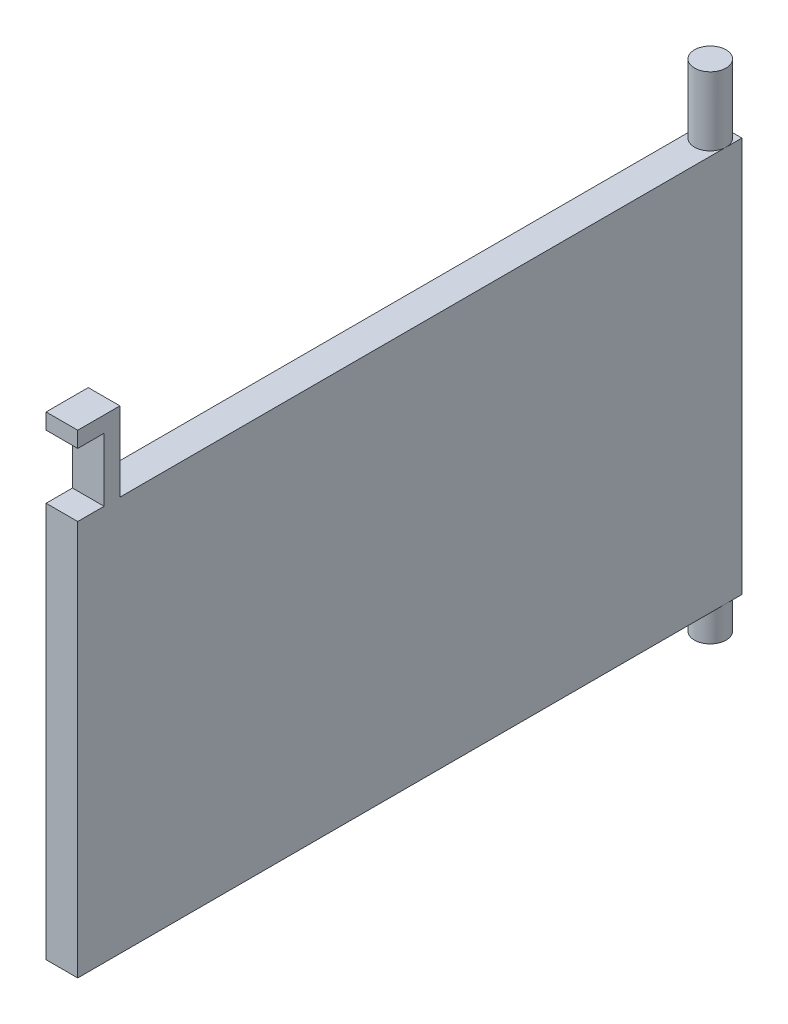
ISO-10303-21;
HEADER;
FILE_DESCRIPTION(('STEP AP214'),'2;1');
FILE_NAME('part.step','',(''),(''),'','','');
FILE_SCHEMA(('AUTOMOTIVE_DESIGN { 1 0 10303 214 1 1 1 1 }'));
ENDSEC;
DATA;
#1=APPLICATION_CONTEXT('core data for automotive mechanical design processes');
#2=APPLICATION_PROTOCOL_DEFINITION('international standard','automotive_design',2000,#1);
#3=PRODUCT_CONTEXT('',#1,'mechanical');
#4=PRODUCT('Part','Part','',(#3));
#5=PRODUCT_RELATED_PRODUCT_CATEGORY('part','',(#4));
#6=PRODUCT_DEFINITION_FORMATION('','',#4);
#7=PRODUCT_DEFINITION_CONTEXT('part definition',#1,'design');
#8=PRODUCT_DEFINITION('design','',#6,#7);
#9=PRODUCT_DEFINITION_SHAPE('','',#8);
#10=(LENGTH_UNIT() NAMED_UNIT(*) SI_UNIT(.MILLI.,.METRE.));
#11=(NAMED_UNIT(*) PLANE_ANGLE_UNIT() SI_UNIT($,.RADIAN.));
#12=(NAMED_UNIT(*) SI_UNIT($,.STERADIAN.) SOLID_ANGLE_UNIT());
#13=UNCERTAINTY_MEASURE_WITH_UNIT(LENGTH_MEASURE(1.E-05),#10,'distance_accuracy_value','');
#14=(GEOMETRIC_REPRESENTATION_CONTEXT(3) GLOBAL_UNCERTAINTY_ASSIGNED_CONTEXT((#13)) GLOBAL_UNIT_ASSIGNED_CONTEXT((#10,
#11,#12)) REPRESENTATION_CONTEXT('',''));
#15=CARTESIAN_POINT('',(0.,0.,0.));
#16=DIRECTION('',(0.,0.,1.));
#17=DIRECTION('',(1.,0.,0.));
#18=AXIS2_PLACEMENT_3D('',#15,#16,#17);
#19=CARTESIAN_POINT('',(0.,100.,121.));
#20=DIRECTION('',(0.,0.,-1.));
#21=DIRECTION('',(-1.,0.,0.));
#22=AXIS2_PLACEMENT_3D('',#19,#20,#21);
#23=PLANE('',#22);
#24=DIRECTION('',(1.,0.,0.));
#25=VECTOR('',#24,1.);
#26=CARTESIAN_POINT('',(0.,97.,121.));
#27=LINE('',#26,#25);
#28=CARTESIAN_POINT('',(0.,97.,121.));
#29=VERTEX_POINT('',#28);
#30=CARTESIAN_POINT('',(6.,97.,121.));
#31=VERTEX_POINT('',#30);
#32=EDGE_CURVE('E167',#29,#31,#27,.T.);
#33=ORIENTED_EDGE('',*,*,#32,.F.);
#34=DIRECTION('',(0.,-1.,0.));
#35=VECTOR('',#34,1.);
#36=CARTESIAN_POINT('',(0.,100.,121.));
#37=LINE('',#36,#35);
#38=CARTESIAN_POINT('',(0.,85.,121.));
#39=VERTEX_POINT('',#38);
#40=EDGE_CURVE('E171',#29,#39,#37,.T.);
#41=ORIENTED_EDGE('',*,*,#40,.T.);
#42=DIRECTION('',(1.,0.,0.));
#43=VECTOR('',#42,1.);
#44=CARTESIAN_POINT('',(0.,85.,121.));
#45=LINE('',#44,#43);
#46=CARTESIAN_POINT('',(6.,85.,121.));
#47=VERTEX_POINT('',#46);
#48=EDGE_CURVE('E172',#39,#47,#45,.T.);
#49=ORIENTED_EDGE('',*,*,#48,.T.);
#50=DIRECTION('',(0.,-1.,0.));
#51=VECTOR('',#50,1.);
#52=CARTESIAN_POINT('',(6.,100.,121.));
#53=LINE('',#52,#51);
#54=EDGE_CURVE('E191',#31,#47,#53,.T.);
#55=ORIENTED_EDGE('',*,*,#54,.F.);
#56=EDGE_LOOP('',(#33,#41,#49,#55));
#57=FACE_BOUND('',#56,.T.);
#58=ADVANCED_FACE('F50',(#57),#23,.F.);
#59=CARTESIAN_POINT('',(3.,85.,3.));
#60=DIRECTION('',(0.,1.,0.));
#61=DIRECTION('',(0.,0.,1.));
#62=AXIS2_PLACEMENT_3D('',#59,#60,#61);
#63=PLANE('',#62);
#64=DIRECTION('',(0.,0.,-1.));
#65=VECTOR('',#64,1.);
#66=CARTESIAN_POINT('',(6.,85.,6.));
#67=LINE('',#66,#65);
#68=CARTESIAN_POINT('',(6.,85.,126.));
#69=VERTEX_POINT('',#68);
#70=EDGE_CURVE('E231',#69,#47,#67,.T.);
#71=ORIENTED_EDGE('',*,*,#70,.T.);
#72=ORIENTED_EDGE('',*,*,#48,.F.);
#73=DIRECTION('',(0.,0.,1.));
#74=VECTOR('',#73,1.);
#75=CARTESIAN_POINT('',(0.,85.,6.));
#76=LINE('',#75,#74);
#77=CARTESIAN_POINT('',(0.,85.,126.));
#78=VERTEX_POINT('',#77);
#79=EDGE_CURVE('E234',#39,#78,#76,.T.);
#80=ORIENTED_EDGE('',*,*,#79,.T.);
#81=DIRECTION('',(-1.,0.,0.));
#82=VECTOR('',#81,1.);
#83=CARTESIAN_POINT('',(0.,85.,126.));
#84=LINE('',#83,#82);
#85=EDGE_CURVE('E206',#69,#78,#84,.T.);
#86=ORIENTED_EDGE('',*,*,#85,.F.);
#87=EDGE_LOOP('',(#71,#72,#80,#86));
#88=FACE_BOUND('',#87,.T.);
#89=ADVANCED_FACE('F295',(#88),#63,.T.);
#90=CARTESIAN_POINT('',(0.,85.,3.));
#91=VERTEX_POINT('',#90);
#92=CARTESIAN_POINT('',(0.,85.,118.));
#93=VERTEX_POINT('',#92);
#94=EDGE_CURVE('E235',#91,#93,#76,.T.);
#95=ORIENTED_EDGE('',*,*,#94,.T.);
#96=DIRECTION('',(-1.,0.,0.));
#97=VECTOR('',#96,1.);
#98=CARTESIAN_POINT('',(0.,85.,118.));
#99=LINE('',#98,#97);
#100=CARTESIAN_POINT('',(6.,85.,118.));
#101=VERTEX_POINT('',#100);
#102=EDGE_CURVE('E175',#101,#93,#99,.T.);
#103=ORIENTED_EDGE('',*,*,#102,.F.);
#104=CARTESIAN_POINT('',(6.,85.,3.));
#105=VERTEX_POINT('',#104);
#106=EDGE_CURVE('E230',#101,#105,#67,.T.);
#107=ORIENTED_EDGE('',*,*,#106,.T.);
#108=CARTESIAN_POINT('',(3.,85.,3.));
#109=DIRECTION('',(0.,1.,0.));
#110=DIRECTION('',(0.,0.,1.));
#111=AXIS2_PLACEMENT_3D('',#108,#109,#110);
#112=CIRCLE('',#111,3.);
#113=EDGE_CURVE('E222',#91,#105,#112,.T.);
#114=ORIENTED_EDGE('',*,*,#113,.F.);
#115=EDGE_LOOP('',(#95,#103,#107,#114));
#116=FACE_BOUND('',#115,.T.);
#117=ADVANCED_FACE('F259',(#116),#63,.T.);
#118=CARTESIAN_POINT('',(3.,85.,3.));
#119=DIRECTION('',(0.,1.,0.));
#120=DIRECTION('',(0.,0.,1.));
#121=AXIS2_PLACEMENT_3D('',#118,#119,#120);
#122=CYLINDRICAL_SURFACE('',#121,3.);
#123=CARTESIAN_POINT('',(3.,85.,0.));
#124=VERTEX_POINT('',#123);
#125=EDGE_CURVE('E225',#124,#91,#112,.T.);
#126=ORIENTED_EDGE('',*,*,#125,.T.);
#127=ORIENTED_EDGE('',*,*,#113,.T.);
#128=EDGE_CURVE('E226',#105,#124,#112,.T.);
#129=ORIENTED_EDGE('',*,*,#128,.T.);
#130=EDGE_LOOP('',(#126,#127,#129));
#131=FACE_BOUND('',#130,.T.);
#132=CARTESIAN_POINT('',(3.,98.,3.));
#133=DIRECTION('',(0.,1.,0.));
#134=DIRECTION('',(0.,0.,1.));
#135=AXIS2_PLACEMENT_3D('',#132,#133,#134);
#136=CIRCLE('',#135,3.);
#137=CARTESIAN_POINT('',(3.,98.,6.));
#138=VERTEX_POINT('',#137);
#139=EDGE_CURVE('E194',#138,#138,#136,.T.);
#140=ORIENTED_EDGE('',*,*,#139,.F.);
#141=EDGE_LOOP('',(#140));
#142=FACE_BOUND('',#141,.T.);
#143=ADVANCED_FACE('F263',(#131,#142),#122,.T.);
#144=CARTESIAN_POINT('',(3.,10.,3.));
#145=DIRECTION('',(0.,-1.,0.));
#146=DIRECTION('',(0.,0.,-1.));
#147=AXIS2_PLACEMENT_3D('',#144,#145,#146);
#148=CYLINDRICAL_SURFACE('',#147,3.);
#149=CARTESIAN_POINT('',(3.,10.,3.));
#150=DIRECTION('',(0.,-1.,0.));
#151=DIRECTION('',(0.,0.,-1.));
#152=AXIS2_PLACEMENT_3D('',#149,#150,#151);
#153=CIRCLE('',#152,3.);
#154=CARTESIAN_POINT('',(6.,10.,3.));
#155=VERTEX_POINT('',#154);
#156=CARTESIAN_POINT('',(0.,10.,3.));
#157=VERTEX_POINT('',#156);
#158=EDGE_CURVE('E217',#155,#157,#153,.T.);
#159=ORIENTED_EDGE('',*,*,#158,.T.);
#160=CARTESIAN_POINT('',(3.,10.,0.));
#161=VERTEX_POINT('',#160);
#162=EDGE_CURVE('E212',#157,#161,#153,.T.);
#163=ORIENTED_EDGE('',*,*,#162,.T.);
#164=EDGE_CURVE('E213',#161,#155,#153,.T.);
#165=ORIENTED_EDGE('',*,*,#164,.T.);
#166=EDGE_LOOP('',(#159,#163,#165));
#167=FACE_BOUND('',#166,.T.);
#168=CARTESIAN_POINT('',(3.,4.,3.));
#169=DIRECTION('',(0.,-1.,0.));
#170=DIRECTION('',(0.,0.,-1.));
#171=AXIS2_PLACEMENT_3D('',#168,#169,#170);
#172=CIRCLE('',#171,3.);
#173=CARTESIAN_POINT('',(3.,4.,0.));
#174=VERTEX_POINT('',#173);
#175=EDGE_CURVE('E209',#174,#174,#172,.T.);
#176=ORIENTED_EDGE('',*,*,#175,.F.);
#177=EDGE_LOOP('',(#176));
#178=FACE_BOUND('',#177,.T.);
#179=ADVANCED_FACE('F282',(#167,#178),#148,.T.);
#180=CARTESIAN_POINT('',(0.,0.,6.));
#181=DIRECTION('',(1.,0.,0.));
#182=DIRECTION('',(0.,0.,-1.));
#183=AXIS2_PLACEMENT_3D('',#180,#181,#182);
#184=PLANE('',#183);
#185=DIRECTION('',(0.,0.,-1.));
#186=VECTOR('',#185,1.);
#187=CARTESIAN_POINT('',(0.,10.,6.));
#188=LINE('',#187,#186);
#189=CARTESIAN_POINT('',(0.,10.,126.));
#190=VERTEX_POINT('',#189);
#191=EDGE_CURVE('E221',#190,#157,#188,.T.);
#192=ORIENTED_EDGE('',*,*,#191,.F.);
#193=DIRECTION('',(0.,-1.,0.));
#194=VECTOR('',#193,1.);
#195=CARTESIAN_POINT('',(0.,85.,126.));
#196=LINE('',#195,#194);
#197=EDGE_CURVE('E197',#78,#190,#196,.T.);
#198=ORIENTED_EDGE('',*,*,#197,.F.);
#199=ORIENTED_EDGE('',*,*,#79,.F.);
#200=ORIENTED_EDGE('',*,*,#40,.F.);
#201=DIRECTION('',(0.,0.,-1.));
#202=VECTOR('',#201,1.);
#203=CARTESIAN_POINT('',(0.,97.,126.));
#204=LINE('',#203,#202);
#205=CARTESIAN_POINT('',(0.,97.,126.));
#206=VERTEX_POINT('',#205);
#207=EDGE_CURVE('E150',#206,#29,#204,.T.);
#208=ORIENTED_EDGE('',*,*,#207,.F.);
#209=DIRECTION('',(0.,-1.,0.));
#210=VECTOR('',#209,1.);
#211=CARTESIAN_POINT('',(0.,100.,126.));
#212=LINE('',#211,#210);
#213=CARTESIAN_POINT('',(0.,100.,126.));
#214=VERTEX_POINT('',#213);
#215=EDGE_CURVE('E158',#214,#206,#212,.T.);
#216=ORIENTED_EDGE('',*,*,#215,.F.);
#217=DIRECTION('',(0.,0.,1.));
#218=VECTOR('',#217,1.);
#219=CARTESIAN_POINT('',(0.,100.,118.));
#220=LINE('',#219,#218);
#221=CARTESIAN_POINT('',(0.,100.,118.));
#222=VERTEX_POINT('',#221);
#223=EDGE_CURVE('E180',#222,#214,#220,.T.);
#224=ORIENTED_EDGE('',*,*,#223,.F.);
#225=DIRECTION('',(0.,-1.,0.));
#226=VECTOR('',#225,1.);
#227=CARTESIAN_POINT('',(0.,100.,118.));
#228=LINE('',#227,#226);
#229=EDGE_CURVE('E185',#222,#93,#228,.T.);
#230=ORIENTED_EDGE('',*,*,#229,.T.);
#231=ORIENTED_EDGE('',*,*,#94,.F.);
#232=CARTESIAN_POINT('',(0.,85.,0.));
#233=VERTEX_POINT('',#232);
#234=EDGE_CURVE('E232',#233,#91,#76,.T.);
#235=ORIENTED_EDGE('',*,*,#234,.F.);
#236=DIRECTION('',(0.,-1.,0.));
#237=VECTOR('',#236,1.);
#238=CARTESIAN_POINT('',(0.,0.,0.));
#239=LINE('',#238,#237);
#240=CARTESIAN_POINT('',(0.,10.,0.));
#241=VERTEX_POINT('',#240);
#242=EDGE_CURVE('E236',#233,#241,#239,.T.);
#243=ORIENTED_EDGE('',*,*,#242,.T.);
#244=EDGE_CURVE('E73',#157,#241,#188,.T.);
#245=ORIENTED_EDGE('',*,*,#244,.F.);
#246=EDGE_LOOP('',(#192,#198,#199,#200,#208,#216,#224,#230,#231,#235,#243,#245));
#247=FACE_BOUND('',#246,.T.);
#248=ADVANCED_FACE('F52',(#247),#184,.F.);
#249=CARTESIAN_POINT('',(6.,0.,6.));
#250=DIRECTION('',(-1.,0.,0.));
#251=DIRECTION('',(0.,0.,1.));
#252=AXIS2_PLACEMENT_3D('',#249,#250,#251);
#253=PLANE('',#252);
#254=DIRECTION('',(0.,0.,1.));
#255=VECTOR('',#254,1.);
#256=CARTESIAN_POINT('',(6.,10.,6.));
#257=LINE('',#256,#255);
#258=CARTESIAN_POINT('',(6.,10.,0.));
#259=VERTEX_POINT('',#258);
#260=EDGE_CURVE('E216',#259,#155,#257,.T.);
#261=ORIENTED_EDGE('',*,*,#260,.F.);
#262=DIRECTION('',(0.,1.,0.));
#263=VECTOR('',#262,1.);
#264=CARTESIAN_POINT('',(6.,0.,0.));
#265=LINE('',#264,#263);
#266=CARTESIAN_POINT('',(6.,85.,0.));
#267=VERTEX_POINT('',#266);
#268=EDGE_CURVE('E239',#259,#267,#265,.T.);
#269=ORIENTED_EDGE('',*,*,#268,.T.);
#270=EDGE_CURVE('E227',#105,#267,#67,.T.);
#271=ORIENTED_EDGE('',*,*,#270,.F.);
#272=ORIENTED_EDGE('',*,*,#106,.F.);
#273=DIRECTION('',(0.,-1.,0.));
#274=VECTOR('',#273,1.);
#275=CARTESIAN_POINT('',(6.,100.,118.));
#276=LINE('',#275,#274);
#277=CARTESIAN_POINT('',(6.,100.,118.));
#278=VERTEX_POINT('',#277);
#279=EDGE_CURVE('E65',#278,#101,#276,.T.);
#280=ORIENTED_EDGE('',*,*,#279,.F.);
#281=DIRECTION('',(0.,0.,-1.));
#282=VECTOR('',#281,1.);
#283=CARTESIAN_POINT('',(6.,100.,118.));
#284=LINE('',#283,#282);
#285=CARTESIAN_POINT('',(6.,100.,126.));
#286=VERTEX_POINT('',#285);
#287=EDGE_CURVE('E182',#286,#278,#284,.T.);
#288=ORIENTED_EDGE('',*,*,#287,.F.);
#289=DIRECTION('',(0.,1.,0.));
#290=VECTOR('',#289,1.);
#291=CARTESIAN_POINT('',(6.,100.,126.));
#292=LINE('',#291,#290);
#293=CARTESIAN_POINT('',(6.,97.,126.));
#294=VERTEX_POINT('',#293);
#295=EDGE_CURVE('E157',#294,#286,#292,.T.);
#296=ORIENTED_EDGE('',*,*,#295,.F.);
#297=DIRECTION('',(0.,0.,-1.));
#298=VECTOR('',#297,1.);
#299=CARTESIAN_POINT('',(6.,97.,126.));
#300=LINE('',#299,#298);
#301=EDGE_CURVE('E153',#294,#31,#300,.T.);
#302=ORIENTED_EDGE('',*,*,#301,.T.);
#303=ORIENTED_EDGE('',*,*,#54,.T.);
#304=ORIENTED_EDGE('',*,*,#70,.F.);
#305=DIRECTION('',(0.,1.,0.));
#306=VECTOR('',#305,1.);
#307=CARTESIAN_POINT('',(6.,85.,126.));
#308=LINE('',#307,#306);
#309=CARTESIAN_POINT('',(6.,10.,126.));
#310=VERTEX_POINT('',#309);
#311=EDGE_CURVE('E203',#310,#69,#308,.T.);
#312=ORIENTED_EDGE('',*,*,#311,.F.);
#313=EDGE_CURVE('E219',#155,#310,#257,.T.);
#314=ORIENTED_EDGE('',*,*,#313,.F.);
#315=EDGE_LOOP('',(#261,#269,#271,#272,#280,#288,#296,#302,#303,#304,#312,#314));
#316=FACE_BOUND('',#315,.T.);
#317=ADVANCED_FACE('F270',(#316),#253,.F.);
#318=CARTESIAN_POINT('',(0.,0.,0.));
#319=DIRECTION('',(0.,0.,-1.));
#320=DIRECTION('',(-1.,0.,0.));
#321=AXIS2_PLACEMENT_3D('',#318,#319,#320);
#322=PLANE('',#321);
#323=ORIENTED_EDGE('',*,*,#268,.F.);
#324=DIRECTION('',(-1.,0.,0.));
#325=VECTOR('',#324,1.);
#326=CARTESIAN_POINT('',(0.,10.,0.));
#327=LINE('',#326,#325);
#328=EDGE_CURVE('E13',#259,#161,#327,.T.);
#329=ORIENTED_EDGE('',*,*,#328,.T.);
#330=EDGE_CURVE('E54',#161,#241,#327,.T.);
#331=ORIENTED_EDGE('',*,*,#330,.T.);
#332=ORIENTED_EDGE('',*,*,#242,.F.);
#333=DIRECTION('',(1.,0.,0.));
#334=VECTOR('',#333,1.);
#335=CARTESIAN_POINT('',(0.,85.,0.));
#336=LINE('',#335,#334);
#337=EDGE_CURVE('E242',#233,#124,#336,.T.);
#338=ORIENTED_EDGE('',*,*,#337,.T.);
#339=EDGE_CURVE('E240',#124,#267,#336,.T.);
#340=ORIENTED_EDGE('',*,*,#339,.T.);
#341=EDGE_LOOP('',(#323,#329,#331,#332,#338,#340));
#342=FACE_BOUND('',#341,.T.);
#343=ADVANCED_FACE('F247',(#342),#322,.T.);
#344=ORIENTED_EDGE('',*,*,#234,.T.);
#345=ORIENTED_EDGE('',*,*,#125,.F.);
#346=ORIENTED_EDGE('',*,*,#337,.F.);
#347=EDGE_LOOP('',(#344,#345,#346));
#348=FACE_BOUND('',#347,.T.);
#349=ADVANCED_FACE('F255',(#348),#63,.T.);
#350=ORIENTED_EDGE('',*,*,#270,.T.);
#351=ORIENTED_EDGE('',*,*,#339,.F.);
#352=ORIENTED_EDGE('',*,*,#128,.F.);
#353=EDGE_LOOP('',(#350,#351,#352));
#354=FACE_BOUND('',#353,.T.);
#355=ADVANCED_FACE('F267',(#354),#63,.T.);
#356=CARTESIAN_POINT('',(3.,10.,3.));
#357=DIRECTION('',(0.,-1.,0.));
#358=DIRECTION('',(0.,0.,-1.));
#359=AXIS2_PLACEMENT_3D('',#356,#357,#358);
#360=PLANE('',#359);
#361=ORIENTED_EDGE('',*,*,#313,.T.);
#362=DIRECTION('',(1.,0.,0.));
#363=VECTOR('',#362,1.);
#364=CARTESIAN_POINT('',(0.,10.,126.));
#365=LINE('',#364,#363);
#366=EDGE_CURVE('E200',#190,#310,#365,.T.);
#367=ORIENTED_EDGE('',*,*,#366,.F.);
#368=ORIENTED_EDGE('',*,*,#191,.T.);
#369=ORIENTED_EDGE('',*,*,#158,.F.);
#370=EDGE_LOOP('',(#361,#367,#368,#369));
#371=FACE_BOUND('',#370,.T.);
#372=ADVANCED_FACE('F279',(#371),#360,.T.);
#373=ORIENTED_EDGE('',*,*,#244,.T.);
#374=ORIENTED_EDGE('',*,*,#330,.F.);
#375=ORIENTED_EDGE('',*,*,#162,.F.);
#376=EDGE_LOOP('',(#373,#374,#375));
#377=FACE_BOUND('',#376,.T.);
#378=ADVANCED_FACE('F284',(#377),#360,.T.);
#379=ORIENTED_EDGE('',*,*,#260,.T.);
#380=ORIENTED_EDGE('',*,*,#164,.F.);
#381=ORIENTED_EDGE('',*,*,#328,.F.);
#382=EDGE_LOOP('',(#379,#380,#381));
#383=FACE_BOUND('',#382,.T.);
#384=ADVANCED_FACE('F276',(#383),#360,.T.);
#385=CARTESIAN_POINT('',(3.,4.,3.));
#386=DIRECTION('',(0.,-1.,0.));
#387=DIRECTION('',(0.,0.,-1.));
#388=AXIS2_PLACEMENT_3D('',#385,#386,#387);
#389=PLANE('',#388);
#390=ORIENTED_EDGE('',*,*,#175,.T.);
#391=EDGE_LOOP('',(#390));
#392=FACE_BOUND('',#391,.T.);
#393=ADVANCED_FACE('F291',(#392),#389,.T.);
#394=CARTESIAN_POINT('',(0.,0.,126.));
#395=DIRECTION('',(0.,0.,1.));
#396=DIRECTION('',(1.,0.,0.));
#397=AXIS2_PLACEMENT_3D('',#394,#395,#396);
#398=PLANE('',#397);
#399=ORIENTED_EDGE('',*,*,#197,.T.);
#400=ORIENTED_EDGE('',*,*,#366,.T.);
#401=ORIENTED_EDGE('',*,*,#311,.T.);
#402=ORIENTED_EDGE('',*,*,#85,.T.);
#403=EDGE_LOOP('',(#399,#400,#401,#402));
#404=FACE_BOUND('',#403,.T.);
#405=ADVANCED_FACE('F310',(#404),#398,.T.);
#406=CARTESIAN_POINT('',(3.,98.,3.));
#407=DIRECTION('',(0.,1.,0.));
#408=DIRECTION('',(0.,0.,1.));
#409=AXIS2_PLACEMENT_3D('',#406,#407,#408);
#410=PLANE('',#409);
#411=ORIENTED_EDGE('',*,*,#139,.T.);
#412=EDGE_LOOP('',(#411));
#413=FACE_BOUND('',#412,.T.);
#414=ADVANCED_FACE('F307',(#413),#410,.T.);
#415=CARTESIAN_POINT('',(0.,100.,118.));
#416=DIRECTION('',(0.,0.,1.));
#417=DIRECTION('',(1.,0.,0.));
#418=AXIS2_PLACEMENT_3D('',#415,#416,#417);
#419=PLANE('',#418);
#420=ORIENTED_EDGE('',*,*,#102,.T.);
#421=ORIENTED_EDGE('',*,*,#229,.F.);
#422=DIRECTION('',(-1.,0.,0.));
#423=VECTOR('',#422,1.);
#424=CARTESIAN_POINT('',(0.,100.,118.));
#425=LINE('',#424,#423);
#426=EDGE_CURVE('E184',#278,#222,#425,.T.);
#427=ORIENTED_EDGE('',*,*,#426,.F.);
#428=ORIENTED_EDGE('',*,*,#279,.T.);
#429=EDGE_LOOP('',(#420,#421,#427,#428));
#430=FACE_BOUND('',#429,.T.);
#431=ADVANCED_FACE('F305',(#430),#419,.F.);
#432=CARTESIAN_POINT('',(0.,100.,0.));
#433=DIRECTION('',(0.,1.,0.));
#434=DIRECTION('',(0.,0.,1.));
#435=AXIS2_PLACEMENT_3D('',#432,#433,#434);
#436=PLANE('',#435);
#437=ORIENTED_EDGE('',*,*,#223,.T.);
#438=DIRECTION('',(-1.,0.,0.));
#439=VECTOR('',#438,1.);
#440=CARTESIAN_POINT('',(0.,100.,126.));
#441=LINE('',#440,#439);
#442=EDGE_CURVE('E164',#286,#214,#441,.T.);
#443=ORIENTED_EDGE('',*,*,#442,.F.);
#444=ORIENTED_EDGE('',*,*,#287,.T.);
#445=ORIENTED_EDGE('',*,*,#426,.T.);
#446=EDGE_LOOP('',(#437,#443,#444,#445));
#447=FACE_BOUND('',#446,.T.);
#448=ADVANCED_FACE('F397',(#447),#436,.T.);
#449=CARTESIAN_POINT('',(0.,97.,126.));
#450=DIRECTION('',(0.,1.,0.));
#451=DIRECTION('',(0.,0.,1.));
#452=AXIS2_PLACEMENT_3D('',#449,#450,#451);
#453=PLANE('',#452);
#454=ORIENTED_EDGE('',*,*,#32,.T.);
#455=ORIENTED_EDGE('',*,*,#301,.F.);
#456=DIRECTION('',(1.,0.,0.));
#457=VECTOR('',#456,1.);
#458=CARTESIAN_POINT('',(0.,97.,126.));
#459=LINE('',#458,#457);
#460=EDGE_CURVE('E146',#206,#294,#459,.T.);
#461=ORIENTED_EDGE('',*,*,#460,.F.);
#462=ORIENTED_EDGE('',*,*,#207,.T.);
#463=EDGE_LOOP('',(#454,#455,#461,#462));
#464=FACE_BOUND('',#463,.T.);
#465=ADVANCED_FACE('F148',(#464),#453,.F.);
#466=CARTESIAN_POINT('',(0.,0.,126.));
#467=DIRECTION('',(0.,0.,1.));
#468=DIRECTION('',(1.,0.,0.));
#469=AXIS2_PLACEMENT_3D('',#466,#467,#468);
#470=PLANE('',#469);
#471=ORIENTED_EDGE('',*,*,#215,.T.);
#472=ORIENTED_EDGE('',*,*,#460,.T.);
#473=ORIENTED_EDGE('',*,*,#295,.T.);
#474=ORIENTED_EDGE('',*,*,#442,.T.);
#475=EDGE_LOOP('',(#471,#472,#473,#474));
#476=FACE_BOUND('',#475,.T.);
#477=ADVANCED_FACE('F162',(#476),#470,.T.);
#478=CLOSED_SHELL('',(#58,#89,#117,#143,#179,#248,#317,#343,#349,#355,#372,#378,#384,#393,#405,
#414,#431,#448,#465,#477));
#479=MANIFOLD_SOLID_BREP('B2',#478);
#480=ADVANCED_BREP_SHAPE_REPRESENTATION('',(#18,#479),#14);
#481=SHAPE_DEFINITION_REPRESENTATION(#9,#480);
ENDSEC;
END-ISO-10303-21;
